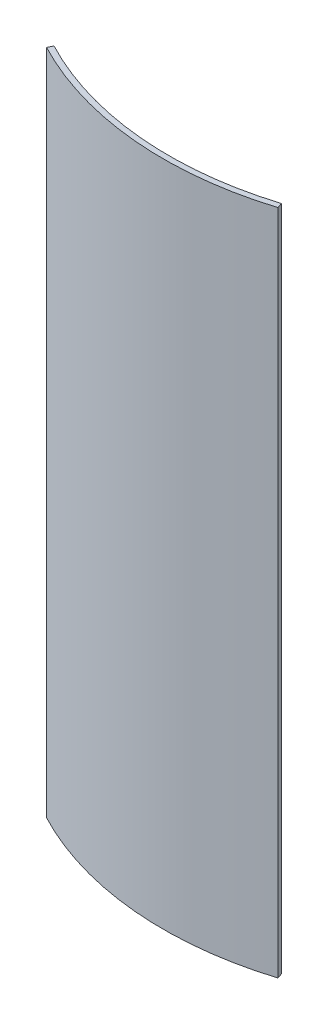
ISO-10303-21;
HEADER;
FILE_DESCRIPTION(('STEP AP214'),'2;1');
FILE_NAME('part.step','',(''),(''),'','','');
FILE_SCHEMA(('AUTOMOTIVE_DESIGN { 1 0 10303 214 1 1 1 1 }'));
ENDSEC;
DATA;
#1=APPLICATION_CONTEXT('core data for automotive mechanical design processes');
#2=APPLICATION_PROTOCOL_DEFINITION('international standard','automotive_design',2000,#1);
#3=PRODUCT_CONTEXT('',#1,'mechanical');
#4=PRODUCT('Part','Part','',(#3));
#5=PRODUCT_RELATED_PRODUCT_CATEGORY('part','',(#4));
#6=PRODUCT_DEFINITION_FORMATION('','',#4);
#7=PRODUCT_DEFINITION_CONTEXT('part definition',#1,'design');
#8=PRODUCT_DEFINITION('design','',#6,#7);
#9=PRODUCT_DEFINITION_SHAPE('','',#8);
#10=(LENGTH_UNIT() NAMED_UNIT(*) SI_UNIT(.MILLI.,.METRE.));
#11=(NAMED_UNIT(*) PLANE_ANGLE_UNIT() SI_UNIT($,.RADIAN.));
#12=(NAMED_UNIT(*) SI_UNIT($,.STERADIAN.) SOLID_ANGLE_UNIT());
#13=UNCERTAINTY_MEASURE_WITH_UNIT(LENGTH_MEASURE(1.E-05),#10,'distance_accuracy_value','');
#14=(GEOMETRIC_REPRESENTATION_CONTEXT(3) GLOBAL_UNCERTAINTY_ASSIGNED_CONTEXT((#13)) GLOBAL_UNIT_ASSIGNED_CONTEXT((#10,
#11,#12)) REPRESENTATION_CONTEXT('',''));
#15=CARTESIAN_POINT('',(0.,0.,0.));
#16=DIRECTION('',(0.,0.,1.));
#17=DIRECTION('',(1.,0.,0.));
#18=AXIS2_PLACEMENT_3D('',#15,#16,#17);
#19=CARTESIAN_POINT('',(0.,152.4,0.));
#20=DIRECTION('',(0.,-1.,0.));
#21=DIRECTION('',(0.,0.,-1.));
#22=AXIS2_PLACEMENT_3D('',#19,#20,#21);
#23=CYLINDRICAL_SURFACE('',#22,76.2);
#24=CARTESIAN_POINT('',(0.,0.,0.));
#25=DIRECTION('',(0.,1.,0.));
#26=DIRECTION('',(0.,0.,1.));
#27=AXIS2_PLACEMENT_3D('',#24,#25,#26);
#28=CIRCLE('',#27,76.2);
#29=CARTESIAN_POINT('',(-35.3862049986547,0.,67.4852316865934));
#30=VERTEX_POINT('',#29);
#31=CARTESIAN_POINT('',(22.6974394405285,0.,72.7410904705417));
#32=VERTEX_POINT('',#31);
#33=EDGE_CURVE('E113',#30,#32,#28,.T.);
#34=ORIENTED_EDGE('',*,*,#33,.T.);
#35=DIRECTION('',(0.,-1.,0.));
#36=VECTOR('',#35,1.);
#37=CARTESIAN_POINT('',(22.6974394405285,152.4,72.7410904705417));
#38=LINE('',#37,#36);
#39=CARTESIAN_POINT('',(22.6974394405285,152.4,72.7410904705417));
#40=VERTEX_POINT('',#39);
#41=EDGE_CURVE('E11',#40,#32,#38,.T.);
#42=ORIENTED_EDGE('',*,*,#41,.F.);
#43=CARTESIAN_POINT('',(0.,152.4,0.));
#44=DIRECTION('',(0.,1.,0.));
#45=DIRECTION('',(0.,0.,1.));
#46=AXIS2_PLACEMENT_3D('',#43,#44,#45);
#47=CIRCLE('',#46,76.2);
#48=CARTESIAN_POINT('',(-35.3862049986547,152.4,67.4852316865934));
#49=VERTEX_POINT('',#48);
#50=EDGE_CURVE('E97',#49,#40,#47,.T.);
#51=ORIENTED_EDGE('',*,*,#50,.F.);
#52=DIRECTION('',(0.,-1.,0.));
#53=VECTOR('',#52,1.);
#54=CARTESIAN_POINT('',(-35.3862049986547,152.4,67.4852316865934));
#55=LINE('',#54,#53);
#56=EDGE_CURVE('E109',#49,#30,#55,.T.);
#57=ORIENTED_EDGE('',*,*,#56,.T.);
#58=EDGE_LOOP('',(#34,#42,#51,#57));
#59=FACE_BOUND('',#58,.T.);
#60=ADVANCED_FACE('F45',(#59),#23,.T.);
#61=CARTESIAN_POINT('',(22.3024907649819,152.4,71.5339346441806));
#62=DIRECTION('',(-0.950425171512883,0.,0.310953362025091));
#63=DIRECTION('',(0.310953362025091,0.,0.950425171512883));
#64=AXIS2_PLACEMENT_3D('',#61,#62,#63);
#65=PLANE('',#64);
#66=DIRECTION('',(-0.310953362025091,0.,-0.950425171512883));
#67=VECTOR('',#66,1.);
#68=CARTESIAN_POINT('',(22.3024907649819,0.,71.5339346441806));
#69=LINE('',#68,#67);
#70=CARTESIAN_POINT('',(22.3024907649819,0.,71.5339346441806));
#71=VERTEX_POINT('',#70);
#72=EDGE_CURVE('E102',#32,#71,#69,.T.);
#73=ORIENTED_EDGE('',*,*,#72,.T.);
#74=DIRECTION('',(0.,-1.,0.));
#75=VECTOR('',#74,1.);
#76=CARTESIAN_POINT('',(22.3024907649819,152.4,71.5339346441806));
#77=LINE('',#76,#75);
#78=CARTESIAN_POINT('',(22.3024907649819,152.4,71.5339346441806));
#79=VERTEX_POINT('',#78);
#80=EDGE_CURVE('E54',#79,#71,#77,.T.);
#81=ORIENTED_EDGE('',*,*,#80,.F.);
#82=DIRECTION('',(-0.310953362025091,0.,-0.950425171512883));
#83=VECTOR('',#82,1.);
#84=CARTESIAN_POINT('',(22.3024907649819,152.4,71.5339346441806));
#85=LINE('',#84,#83);
#86=EDGE_CURVE('E92',#40,#79,#85,.T.);
#87=ORIENTED_EDGE('',*,*,#86,.F.);
#88=ORIENTED_EDGE('',*,*,#41,.T.);
#89=EDGE_LOOP('',(#73,#81,#87,#88));
#90=FACE_BOUND('',#89,.T.);
#91=ADVANCED_FACE('F101',(#90),#65,.F.);
#92=CARTESIAN_POINT('',(0.,152.4,0.));
#93=DIRECTION('',(0.,-1.,0.));
#94=DIRECTION('',(0.,0.,-1.));
#95=AXIS2_PLACEMENT_3D('',#92,#93,#94);
#96=CYLINDRICAL_SURFACE('',#95,74.93);
#97=CARTESIAN_POINT('',(0.,0.,0.));
#98=DIRECTION('',(0.,-1.,0.));
#99=DIRECTION('',(0.,0.,-1.));
#100=AXIS2_PLACEMENT_3D('',#97,#98,#99);
#101=CIRCLE('',#100,74.93);
#102=CARTESIAN_POINT('',(-34.8118878145855,0.,66.3523727291249));
#103=VERTEX_POINT('',#102);
#104=EDGE_CURVE('E79',#71,#103,#101,.T.);
#105=ORIENTED_EDGE('',*,*,#104,.T.);
#106=DIRECTION('',(0.,-1.,0.));
#107=VECTOR('',#106,1.);
#108=CARTESIAN_POINT('',(-34.8118878145855,152.4,66.3523727291249));
#109=LINE('',#108,#107);
#110=CARTESIAN_POINT('',(-34.8118878145855,152.4,66.3523727291249));
#111=VERTEX_POINT('',#110);
#112=EDGE_CURVE('E104',#111,#103,#109,.T.);
#113=ORIENTED_EDGE('',*,*,#112,.F.);
#114=CARTESIAN_POINT('',(0.,152.4,0.));
#115=DIRECTION('',(0.,-1.,0.));
#116=DIRECTION('',(0.,0.,-1.));
#117=AXIS2_PLACEMENT_3D('',#114,#115,#116);
#118=CIRCLE('',#117,74.93);
#119=EDGE_CURVE('E95',#79,#111,#118,.T.);
#120=ORIENTED_EDGE('',*,*,#119,.F.);
#121=ORIENTED_EDGE('',*,*,#80,.T.);
#122=EDGE_LOOP('',(#105,#113,#120,#121));
#123=FACE_BOUND('',#122,.T.);
#124=ADVANCED_FACE('F105',(#123),#96,.F.);
#125=CARTESIAN_POINT('',(-34.8118878145855,152.4,66.3523727291249));
#126=DIRECTION('',(0.891929314707848,0.,0.452174852866442));
#127=DIRECTION('',(0.452174852866442,0.,-0.891929314707848));
#128=AXIS2_PLACEMENT_3D('',#125,#126,#127);
#129=PLANE('',#128);
#130=DIRECTION('',(-0.452174852866442,0.,0.891929314707848));
#131=VECTOR('',#130,1.);
#132=CARTESIAN_POINT('',(-34.8118878145855,0.,66.3523727291249));
#133=LINE('',#132,#131);
#134=EDGE_CURVE('E85',#103,#30,#133,.T.);
#135=ORIENTED_EDGE('',*,*,#134,.T.);
#136=ORIENTED_EDGE('',*,*,#56,.F.);
#137=DIRECTION('',(-0.452174852866442,0.,0.891929314707848));
#138=VECTOR('',#137,1.);
#139=CARTESIAN_POINT('',(-34.8118878145855,152.4,66.3523727291249));
#140=LINE('',#139,#138);
#141=EDGE_CURVE('E62',#111,#49,#140,.T.);
#142=ORIENTED_EDGE('',*,*,#141,.F.);
#143=ORIENTED_EDGE('',*,*,#112,.T.);
#144=EDGE_LOOP('',(#135,#136,#142,#143));
#145=FACE_BOUND('',#144,.T.);
#146=ADVANCED_FACE('F126',(#145),#129,.F.);
#147=CARTESIAN_POINT('',(0.,152.4,0.));
#148=DIRECTION('',(0.,1.,0.));
#149=DIRECTION('',(0.,0.,1.));
#150=AXIS2_PLACEMENT_3D('',#147,#148,#149);
#151=PLANE('',#150);
#152=ORIENTED_EDGE('',*,*,#50,.T.);
#153=ORIENTED_EDGE('',*,*,#86,.T.);
#154=ORIENTED_EDGE('',*,*,#119,.T.);
#155=ORIENTED_EDGE('',*,*,#141,.T.);
#156=EDGE_LOOP('',(#152,#153,#154,#155));
#157=FACE_BOUND('',#156,.T.);
#158=ADVANCED_FACE('F93',(#157),#151,.T.);
#159=CARTESIAN_POINT('',(0.,0.,0.));
#160=DIRECTION('',(0.,1.,0.));
#161=DIRECTION('',(0.,0.,1.));
#162=AXIS2_PLACEMENT_3D('',#159,#160,#161);
#163=PLANE('',#162);
#164=ORIENTED_EDGE('',*,*,#33,.F.);
#165=ORIENTED_EDGE('',*,*,#134,.F.);
#166=ORIENTED_EDGE('',*,*,#104,.F.);
#167=ORIENTED_EDGE('',*,*,#72,.F.);
#168=EDGE_LOOP('',(#164,#165,#166,#167));
#169=FACE_BOUND('',#168,.T.);
#170=ADVANCED_FACE('F129',(#169),#163,.F.);
#171=CLOSED_SHELL('',(#60,#91,#124,#146,#158,#170));
#172=MANIFOLD_SOLID_BREP('B2',#171);
#173=ADVANCED_BREP_SHAPE_REPRESENTATION('',(#18,#172),#14);
#174=SHAPE_DEFINITION_REPRESENTATION(#9,#173);
ENDSEC;
END-ISO-10303-21;
